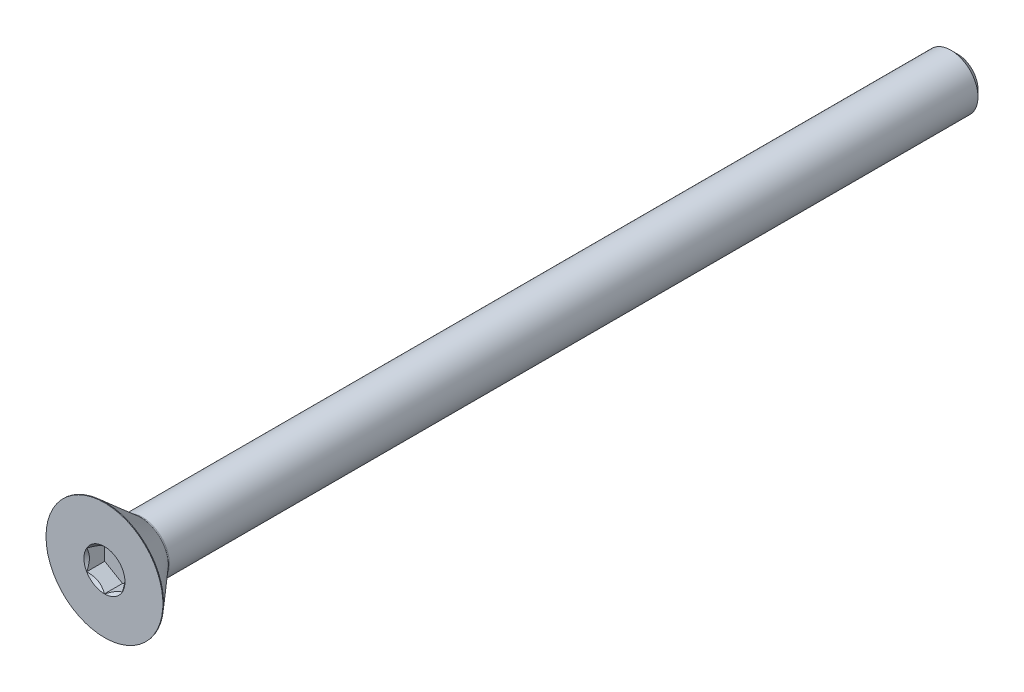
ISO-10303-21;
HEADER;
FILE_DESCRIPTION(('STEP AP214'),'2;1');
FILE_NAME('part.step','',(''),(''),'','','');
FILE_SCHEMA(('AUTOMOTIVE_DESIGN { 1 0 10303 214 1 1 1 1 }'));
ENDSEC;
DATA;
#1=APPLICATION_CONTEXT('core data for automotive mechanical design processes');
#2=APPLICATION_PROTOCOL_DEFINITION('international standard','automotive_design',2000,#1);
#3=PRODUCT_CONTEXT('',#1,'mechanical');
#4=PRODUCT('Part','Part','',(#3));
#5=PRODUCT_RELATED_PRODUCT_CATEGORY('part','',(#4));
#6=PRODUCT_DEFINITION_FORMATION('','',#4);
#7=PRODUCT_DEFINITION_CONTEXT('part definition',#1,'design');
#8=PRODUCT_DEFINITION('design','',#6,#7);
#9=PRODUCT_DEFINITION_SHAPE('','',#8);
#10=(LENGTH_UNIT() NAMED_UNIT(*) SI_UNIT(.MILLI.,.METRE.));
#11=(NAMED_UNIT(*) PLANE_ANGLE_UNIT() SI_UNIT($,.RADIAN.));
#12=(NAMED_UNIT(*) SI_UNIT($,.STERADIAN.) SOLID_ANGLE_UNIT());
#13=UNCERTAINTY_MEASURE_WITH_UNIT(LENGTH_MEASURE(1.E-05),#10,'distance_accuracy_value','');
#14=(GEOMETRIC_REPRESENTATION_CONTEXT(3) GLOBAL_UNCERTAINTY_ASSIGNED_CONTEXT((#13)) GLOBAL_UNIT_ASSIGNED_CONTEXT((#10,
#11,#12)) REPRESENTATION_CONTEXT('',''));
#15=CARTESIAN_POINT('',(0.,0.,0.));
#16=DIRECTION('',(0.,0.,1.));
#17=DIRECTION('',(1.,0.,0.));
#18=AXIS2_PLACEMENT_3D('',#15,#16,#17);
#19=CARTESIAN_POINT('',(0.,0.,38.1));
#20=DIRECTION('',(0.,0.,1.));
#21=DIRECTION('',(1.,0.,0.));
#22=AXIS2_PLACEMENT_3D('',#19,#20,#21);
#23=CONICAL_SURFACE('',#22,1.83308710467706,0.78539816339745);
#24=CARTESIAN_POINT('',(0.,0.,38.1));
#25=DIRECTION('',(0.,0.,1.));
#26=DIRECTION('',(1.,0.,0.));
#27=AXIS2_PLACEMENT_3D('',#24,#25,#26);
#28=CIRCLE('',#27,1.83308710467706);
#29=CARTESIAN_POINT('',(0.,-1.83308710467706,38.1));
#30=VERTEX_POINT('',#29);
#31=CARTESIAN_POINT('',(1.5875,-0.916543552338532,38.1));
#32=VERTEX_POINT('',#31);
#33=EDGE_CURVE('E233',#30,#32,#28,.T.);
#34=ORIENTED_EDGE('',*,*,#33,.T.);
#35=CARTESIAN_POINT('',(1.5877,-0.916428082284693,38.1001154809637));
#36=CARTESIAN_POINT('',(1.53312479190086,-0.947937093371809,38.0686308083706));
#37=CARTESIAN_POINT('',(1.47763696320971,-0.979973006203394,38.0389950460135));
#38=CARTESIAN_POINT('',(1.36449087915364,-1.04529792829092,37.9847322600208));
#39=CARTESIAN_POINT('',(1.30682185887062,-1.07859315267522,37.9601354351332));
#40=CARTESIAN_POINT('',(1.1905349781269,-1.14573141457583,37.9180003642726));
#41=CARTESIAN_POINT('',(1.13194674474407,-1.17955734689075,37.9003561927298));
#42=CARTESIAN_POINT('',(1.01348022674557,-1.24795402294714,37.873171470085));
#43=CARTESIAN_POINT('',(0.953605562983895,-1.28252267618759,37.8636106206951));
#44=CARTESIAN_POINT('',(0.850418771876558,-1.34209759781022,37.854984413104));
#45=CARTESIAN_POINT('',(0.807240015952288,-1.36702686416637,37.8537071928096));
#46=CARTESIAN_POINT('',(0.720953038535399,-1.41684467380557,37.8558570558147));
#47=CARTESIAN_POINT('',(0.677844847078612,-1.44173319974742,37.8592857885493));
#48=CARTESIAN_POINT('',(0.592046335002031,-1.49126899379091,37.8706509944333));
#49=CARTESIAN_POINT('',(0.549356408925406,-1.51591603410293,37.8785913718016));
#50=CARTESIAN_POINT('',(0.464693063478358,-1.56479643938728,37.8985484144511));
#51=CARTESIAN_POINT('',(0.422719959755075,-1.58902962212064,37.9105668292087));
#52=CARTESIAN_POINT('',(0.315211458113566,-1.65109968448354,37.9462468972472));
#53=CARTESIAN_POINT('',(0.250342771708898,-1.68855163804125,37.9725985723031));
#54=CARTESIAN_POINT('',(0.154961599380922,-1.74361998356043,38.0170835368517));
#55=CARTESIAN_POINT('',(0.123530699536156,-1.76176662204668,38.0327128578011));
#56=CARTESIAN_POINT('',(0.061246985569636,-1.79772614107138,38.0653984878611));
#57=CARTESIAN_POINT('',(0.0303939039605752,-1.8155391760437,38.082454115657));
#58=CARTESIAN_POINT('',(-0.000200000000001831,-1.8332025747309,38.1001154809637));
#59=B_SPLINE_CURVE_WITH_KNOTS('',3,(#35,#36,#37,#38,#39,#40,#41,#42,#43,#44,#45,#46,#47,#48,#49,
#50,#51,#52,#53,#54,#55,#56,#57,#58),.UNSPECIFIED.,.F.,.F.,(4,2,2,2,2,2,2,2,2,2,2,4),(0.,
0.211482650810816,0.424197870807277,0.633533884524818,0.842342653263349,0.991755553727142,
1.14122083674205,1.29081565918877,1.44047473906438,1.6781878086972,1.79671410024894,
1.91518409436631),.UNSPECIFIED.);
#60=EDGE_CURVE('E11',#32,#30,#59,.T.);
#61=ORIENTED_EDGE('',*,*,#60,.T.);
#62=EDGE_LOOP('',(#34,#61));
#63=FACE_BOUND('',#62,.T.);
#64=ADVANCED_FACE('F35',(#63),#23,.F.);
#65=CARTESIAN_POINT('',(-1.5875,-0.91654355233853,38.1));
#66=VERTEX_POINT('',#65);
#67=EDGE_CURVE('E238',#66,#30,#28,.T.);
#68=ORIENTED_EDGE('',*,*,#67,.T.);
#69=CARTESIAN_POINT('',(0.000200000000000431,-1.8332025747309,38.1001154809637));
#70=CARTESIAN_POINT('',(-0.0543752080991352,-1.80169356364378,38.0686308083706));
#71=CARTESIAN_POINT('',(-0.109863036790289,-1.7696576508122,38.0389950460135));
#72=CARTESIAN_POINT('',(-0.223009120846358,-1.70433272872468,37.9847322600208));
#73=CARTESIAN_POINT('',(-0.280678141129381,-1.67103750434037,37.9601354351332));
#74=CARTESIAN_POINT('',(-0.396965021873103,-1.60389924243976,37.9180003642726));
#75=CARTESIAN_POINT('',(-0.455553255255931,-1.57007331012484,37.9003561927298));
#76=CARTESIAN_POINT('',(-0.574019773254431,-1.50167663406845,37.873171470085));
#77=CARTESIAN_POINT('',(-0.633894437016105,-1.46710798082801,37.8636106206951));
#78=CARTESIAN_POINT('',(-0.737081228123442,-1.40753305920537,37.854984413104));
#79=CARTESIAN_POINT('',(-0.780259984047712,-1.38260379284922,37.8537071928096));
#80=CARTESIAN_POINT('',(-0.866546961464601,-1.33278598321002,37.8558570558147));
#81=CARTESIAN_POINT('',(-0.909655152921388,-1.30789745726817,37.8592857885493));
#82=CARTESIAN_POINT('',(-0.995453664997969,-1.25836166322468,37.8706509944333));
#83=CARTESIAN_POINT('',(-1.03814359107459,-1.23371462291266,37.8785913718016));
#84=CARTESIAN_POINT('',(-1.12280693652164,-1.18483421762831,37.8985484144511));
#85=CARTESIAN_POINT('',(-1.16478004024493,-1.16060103489495,37.9105668292087));
#86=CARTESIAN_POINT('',(-1.27228854188643,-1.09853097253205,37.9462468972472));
#87=CARTESIAN_POINT('',(-1.3371572282911,-1.06107901897434,37.9725985723031));
#88=CARTESIAN_POINT('',(-1.43253840061908,-1.00601067345516,38.0170835368517));
#89=CARTESIAN_POINT('',(-1.46396930046384,-0.987864034968913,38.0327128578011));
#90=CARTESIAN_POINT('',(-1.52625301443036,-0.951904515944213,38.0653984878611));
#91=CARTESIAN_POINT('',(-1.55710609603942,-0.934091480971892,38.082454115657));
#92=CARTESIAN_POINT('',(-1.5877,-0.916428082284692,38.1001154809637));
#93=B_SPLINE_CURVE_WITH_KNOTS('',3,(#69,#70,#71,#72,#73,#74,#75,#76,#77,#78,#79,#80,#81,#82,#83,
#84,#85,#86,#87,#88,#89,#90,#91,#92),.UNSPECIFIED.,.F.,.F.,(4,2,2,2,2,2,2,2,2,2,2,4),(0.,
0.211482650810816,0.424197870807277,0.633533884524818,0.842342653263349,0.991755553727142,
1.14122083674205,1.29081565918877,1.44047473906438,1.6781878086972,1.79671410024894,
1.91518409436631),.UNSPECIFIED.);
#94=EDGE_CURVE('E49',#30,#66,#93,.T.);
#95=ORIENTED_EDGE('',*,*,#94,.T.);
#96=EDGE_LOOP('',(#68,#95));
#97=FACE_BOUND('',#96,.T.);
#98=ADVANCED_FACE('F224',(#97),#23,.F.);
#99=CARTESIAN_POINT('',(-1.5875,0.916543552338532,38.1));
#100=VERTEX_POINT('',#99);
#101=EDGE_CURVE('E239',#100,#66,#28,.T.);
#102=ORIENTED_EDGE('',*,*,#101,.T.);
#103=CARTESIAN_POINT('',(-1.5875,-1.84970477544497,38.7044452553756));
#104=CARTESIAN_POINT('',(-1.5875,-1.80476240151239,38.6703462071708));
#105=CARTESIAN_POINT('',(-1.5875,-1.75957199117801,38.6365750198928));
#106=CARTESIAN_POINT('',(-1.5875,-1.66859358881314,38.5698243913548));
#107=CARTESIAN_POINT('',(-1.5875,-1.62280545181692,38.5368451478851));
#108=CARTESIAN_POINT('',(-1.5875,-1.48372199901346,38.4388287251651));
#109=CARTESIAN_POINT('',(-1.5875,-1.38939051274161,38.3752376365291));
#110=CARTESIAN_POINT('',(-1.5875,-1.1914395580246,38.2501998751445));
#111=CARTESIAN_POINT('',(-1.5875,-1.08759987522282,38.1890979424035));
#112=CARTESIAN_POINT('',(-1.5875,-0.874706489386582,38.0771896537273));
#113=CARTESIAN_POINT('',(-1.5875,-0.76567197590225,38.0263485632185));
#114=CARTESIAN_POINT('',(-1.5875,-0.602217292000081,37.9641427739001));
#115=CARTESIAN_POINT('',(-1.5875,-0.550263299202898,37.9463261951995));
#116=CARTESIAN_POINT('',(-1.5875,-0.445082037721642,37.9148615140692));
#117=CARTESIAN_POINT('',(-1.5875,-0.391854683409841,37.9012136928237));
#118=CARTESIAN_POINT('',(-1.5875,-0.285344657080772,37.8790290273729));
#119=CARTESIAN_POINT('',(-1.5875,-0.23208080021017,37.8704032745585));
#120=CARTESIAN_POINT('',(-1.5875,-0.124959456415258,37.8584346825164));
#121=CARTESIAN_POINT('',(-1.5875,-0.0711020784671781,37.8550908892227));
#122=CARTESIAN_POINT('',(-1.5875,0.0346213127870723,37.8539438271109));
#123=CARTESIAN_POINT('',(-1.5875,0.0864851538798602,37.8559346608082));
#124=CARTESIAN_POINT('',(-1.5875,0.189778917943214,37.8648876527514));
#125=CARTESIAN_POINT('',(-1.5875,0.241208798942214,37.8718502864056));
#126=CARTESIAN_POINT('',(-1.5875,0.344133383886249,37.8904812853777));
#127=CARTESIAN_POINT('',(-1.5875,0.395613227208262,37.9022304949867));
#128=CARTESIAN_POINT('',(-1.5875,0.49744523880822,37.9298036611326));
#129=CARTESIAN_POINT('',(-1.5875,0.547797493505242,37.9456273042326));
#130=CARTESIAN_POINT('',(-1.5875,0.705347074888852,38.0011176410875));
#131=CARTESIAN_POINT('',(-1.5875,0.810327219424591,38.0470631846965));
#132=CARTESIAN_POINT('',(-1.5875,1.01536433721947,38.1492446076069));
#133=CARTESIAN_POINT('',(-1.5875,1.1154020418522,38.2055172602773));
#134=CARTESIAN_POINT('',(-1.5875,1.30660224236785,38.3216420088267));
#135=CARTESIAN_POINT('',(-1.5875,1.39795887507227,38.3811784333227));
#136=CARTESIAN_POINT('',(-1.5875,1.53255412415746,38.4732282143955));
#137=CARTESIAN_POINT('',(-1.5875,1.57683885315435,38.5042385020961));
#138=CARTESIAN_POINT('',(-1.5875,1.66480239811795,38.5670825224737));
#139=CARTESIAN_POINT('',(-1.5875,1.70848137749646,38.5989160261633));
#140=CARTESIAN_POINT('',(-1.5875,1.75190803967257,38.6310909828344));
#141=B_SPLINE_CURVE_WITH_KNOTS('',3,(#103,#104,#105,#106,#107,#108,#109,#110,#111,#112,#113,
#114,#115,#116,#117,#118,#119,#120,#121,#122,#123,#124,#125,#126,#127,#128,#129,#130,#131,#132,
#133,#134,#135,#136,#137,#138,#139,#140),.UNSPECIFIED.,.F.,.F.,(4,2,2,2,2,2,2,2,2,2,2,2,2,2,2,2,
2,2,4),(0.,0.16923836493243,0.338518567064951,0.679661123808213,1.04081978780736,
1.40073457216113,1.56536778601317,1.73001210198752,1.89164527462954,2.05324924857509,
2.20870658565539,2.36417878970806,2.52239358424591,2.68059621131738,3.0233722729095,
3.36739346781147,3.69436280662922,3.85654464660761,4.0186818490024),.UNSPECIFIED.);
#142=EDGE_CURVE('E198',#66,#100,#141,.T.);
#143=ORIENTED_EDGE('',*,*,#142,.T.);
#144=EDGE_LOOP('',(#102,#143));
#145=FACE_BOUND('',#144,.T.);
#146=ADVANCED_FACE('F229',(#145),#23,.F.);
#147=CARTESIAN_POINT('',(0.,1.83308710467706,38.1));
#148=VERTEX_POINT('',#147);
#149=EDGE_CURVE('E142',#148,#100,#28,.T.);
#150=ORIENTED_EDGE('',*,*,#149,.T.);
#151=CARTESIAN_POINT('',(-1.5877,0.916428082284694,38.1001154809637));
#152=CARTESIAN_POINT('',(-1.53312479190087,0.947937093371809,38.0686308083706));
#153=CARTESIAN_POINT('',(-1.47763696320971,0.979973006203395,38.0389950460135));
#154=CARTESIAN_POINT('',(-1.36449087915364,1.04529792829092,37.9847322600208));
#155=CARTESIAN_POINT('',(-1.30682185887062,1.07859315267522,37.9601354351332));
#156=CARTESIAN_POINT('',(-1.1905349781269,1.14573141457583,37.9180003642726));
#157=CARTESIAN_POINT('',(-1.13194674474407,1.17955734689075,37.9003561927298));
#158=CARTESIAN_POINT('',(-1.01348022674557,1.24795402294714,37.873171470085));
#159=CARTESIAN_POINT('',(-0.953605562983896,1.28252267618759,37.8636106206951));
#160=CARTESIAN_POINT('',(-0.850418771876559,1.34209759781022,37.854984413104));
#161=CARTESIAN_POINT('',(-0.807240015952289,1.36702686416637,37.8537071928096));
#162=CARTESIAN_POINT('',(-0.7209530385354,1.41684467380557,37.8558570558147));
#163=CARTESIAN_POINT('',(-0.677844847078613,1.44173319974742,37.8592857885493));
#164=CARTESIAN_POINT('',(-0.592046335002032,1.49126899379091,37.8706509944333));
#165=CARTESIAN_POINT('',(-0.549356408925407,1.51591603410293,37.8785913718016));
#166=CARTESIAN_POINT('',(-0.46469306347836,1.56479643938728,37.8985484144511));
#167=CARTESIAN_POINT('',(-0.422719959755076,1.58902962212064,37.9105668292087));
#168=CARTESIAN_POINT('',(-0.315211458113567,1.65109968448354,37.9462468972472));
#169=CARTESIAN_POINT('',(-0.2503427717089,1.68855163804125,37.9725985723031));
#170=CARTESIAN_POINT('',(-0.154961599380924,1.74361998356043,38.0170835368517));
#171=CARTESIAN_POINT('',(-0.123530699536157,1.76176662204668,38.0327128578011));
#172=CARTESIAN_POINT('',(-0.061246985569637,1.79772614107138,38.0653984878611));
#173=CARTESIAN_POINT('',(-0.0303939039605758,1.8155391760437,38.082454115657));
#174=CARTESIAN_POINT('',(0.000200000000001483,1.8332025747309,38.1001154809637));
#175=B_SPLINE_CURVE_WITH_KNOTS('',3,(#151,#152,#153,#154,#155,#156,#157,#158,#159,#160,#161,
#162,#163,#164,#165,#166,#167,#168,#169,#170,#171,#172,#173,#174),.UNSPECIFIED.,.F.,.F.,(4,2,2,
2,2,2,2,2,2,2,2,4),(0.,0.211482650810816,0.424197870807276,0.633533884524818,0.842342653263348,
0.991755553727141,1.14122083674205,1.29081565918877,1.44047473906438,1.6781878086972,
1.79671410024894,1.91518409436631),.UNSPECIFIED.);
#176=EDGE_CURVE('E106',#100,#148,#175,.T.);
#177=ORIENTED_EDGE('',*,*,#176,.T.);
#178=EDGE_LOOP('',(#150,#177));
#179=FACE_BOUND('',#178,.T.);
#180=ADVANCED_FACE('F252',(#179),#23,.F.);
#181=CARTESIAN_POINT('',(1.5875,0.916543552338531,38.1));
#182=VERTEX_POINT('',#181);
#183=EDGE_CURVE('E138',#182,#148,#28,.T.);
#184=ORIENTED_EDGE('',*,*,#183,.T.);
#185=CARTESIAN_POINT('',(-0.000200000000000509,1.8332025747309,38.1001154809637));
#186=CARTESIAN_POINT('',(0.054375208099135,1.80169356364378,38.0686308083706));
#187=CARTESIAN_POINT('',(0.109863036790288,1.7696576508122,38.0389950460135));
#188=CARTESIAN_POINT('',(0.223009120846358,1.70433272872468,37.9847322600208));
#189=CARTESIAN_POINT('',(0.280678141129381,1.67103750434037,37.9601354351332));
#190=CARTESIAN_POINT('',(0.396965021873103,1.60389924243976,37.9180003642726));
#191=CARTESIAN_POINT('',(0.455553255255931,1.57007331012484,37.9003561927298));
#192=CARTESIAN_POINT('',(0.574019773254431,1.50167663406845,37.873171470085));
#193=CARTESIAN_POINT('',(0.633894437016105,1.46710798082801,37.8636106206951));
#194=CARTESIAN_POINT('',(0.737081228123442,1.40753305920537,37.854984413104));
#195=CARTESIAN_POINT('',(0.780259984047712,1.38260379284922,37.8537071928096));
#196=CARTESIAN_POINT('',(0.866546961464601,1.33278598321002,37.8558570558147));
#197=CARTESIAN_POINT('',(0.909655152921388,1.30789745726817,37.8592857885493));
#198=CARTESIAN_POINT('',(0.99545366499797,1.25836166322468,37.8706509944333));
#199=CARTESIAN_POINT('',(1.03814359107459,1.23371462291266,37.8785913718016));
#200=CARTESIAN_POINT('',(1.12280693652164,1.18483421762831,37.8985484144511));
#201=CARTESIAN_POINT('',(1.16478004024493,1.16060103489495,37.9105668292087));
#202=CARTESIAN_POINT('',(1.27228854188643,1.09853097253205,37.9462468972472));
#203=CARTESIAN_POINT('',(1.3371572282911,1.06107901897434,37.9725985723031));
#204=CARTESIAN_POINT('',(1.43253840061908,1.00601067345516,38.0170835368517));
#205=CARTESIAN_POINT('',(1.46396930046385,0.987864034968913,38.0327128578011));
#206=CARTESIAN_POINT('',(1.52625301443037,0.951904515944213,38.0653984878611));
#207=CARTESIAN_POINT('',(1.55710609603943,0.934091480971892,38.082454115657));
#208=CARTESIAN_POINT('',(1.5877,0.916428082284692,38.1001154809637));
#209=B_SPLINE_CURVE_WITH_KNOTS('',3,(#185,#186,#187,#188,#189,#190,#191,#192,#193,#194,#195,
#196,#197,#198,#199,#200,#201,#202,#203,#204,#205,#206,#207,#208),.UNSPECIFIED.,.F.,.F.,(4,2,2,
2,2,2,2,2,2,2,2,4),(0.,0.211482650810816,0.424197870807277,0.633533884524818,0.842342653263349,
0.991755553727143,1.14122083674205,1.29081565918878,1.44047473906438,1.6781878086972,
1.79671410024894,1.91518409436631),.UNSPECIFIED.);
#210=EDGE_CURVE('E168',#148,#182,#209,.T.);
#211=ORIENTED_EDGE('',*,*,#210,.T.);
#212=EDGE_LOOP('',(#184,#211));
#213=FACE_BOUND('',#212,.T.);
#214=ADVANCED_FACE('F185',(#213),#23,.F.);
#215=CARTESIAN_POINT('',(0.,0.,-38.1));
#216=DIRECTION('',(0.,0.,-1.));
#217=DIRECTION('',(-1.,0.,0.));
#218=AXIS2_PLACEMENT_3D('',#215,#216,#217);
#219=CYLINDRICAL_SURFACE('',#218,5.21970000000001);
#220=CARTESIAN_POINT('',(0.,0.,38.1));
#221=DIRECTION('',(0.,0.,-1.));
#222=DIRECTION('',(-1.,0.,0.));
#223=AXIS2_PLACEMENT_3D('',#220,#221,#222);
#224=CIRCLE('',#223,5.21970000000001);
#225=CARTESIAN_POINT('',(-5.21970000000001,0.,38.1));
#226=VERTEX_POINT('',#225);
#227=EDGE_CURVE('E157',#226,#226,#224,.T.);
#228=ORIENTED_EDGE('',*,*,#227,.T.);
#229=EDGE_LOOP('',(#228));
#230=FACE_BOUND('',#229,.T.);
#231=CARTESIAN_POINT('',(0.,0.,38.035484));
#232=DIRECTION('',(0.,0.,-1.));
#233=DIRECTION('',(-1.,0.,0.));
#234=AXIS2_PLACEMENT_3D('',#231,#232,#233);
#235=CIRCLE('',#234,5.21970000000001);
#236=CARTESIAN_POINT('',(-5.21970000000001,0.,38.035484));
#237=VERTEX_POINT('',#236);
#238=EDGE_CURVE('E141',#237,#237,#235,.T.);
#239=ORIENTED_EDGE('',*,*,#238,.F.);
#240=EDGE_LOOP('',(#239));
#241=FACE_BOUND('',#240,.T.);
#242=ADVANCED_FACE('F37',(#230,#241),#219,.T.);
#243=CARTESIAN_POINT('',(0.,0.,38.1));
#244=DIRECTION('',(0.,0.,1.));
#245=DIRECTION('',(1.,0.,0.));
#246=AXIS2_PLACEMENT_3D('',#243,#244,#245);
#247=PLANE('',#246);
#248=ORIENTED_EDGE('',*,*,#183,.F.);
#249=EDGE_CURVE('E131',#32,#182,#28,.T.);
#250=ORIENTED_EDGE('',*,*,#249,.F.);
#251=ORIENTED_EDGE('',*,*,#33,.F.);
#252=ORIENTED_EDGE('',*,*,#67,.F.);
#253=ORIENTED_EDGE('',*,*,#101,.F.);
#254=ORIENTED_EDGE('',*,*,#149,.F.);
#255=EDGE_LOOP('',(#248,#250,#251,#252,#253,#254));
#256=FACE_BOUND('',#255,.T.);
#257=ORIENTED_EDGE('',*,*,#227,.F.);
#258=EDGE_LOOP('',(#257));
#259=FACE_BOUND('',#258,.T.);
#260=ADVANCED_FACE('F243',(#256,#259),#247,.T.);
#261=CARTESIAN_POINT('',(0.,1.81768750000001,-38.1));
#262=DIRECTION('',(0.,0.,-1.));
#263=DIRECTION('',(-1.,0.,0.));
#264=AXIS2_PLACEMENT_3D('',#261,#262,#263);
#265=PLANE('',#264);
#266=CARTESIAN_POINT('',(0.,0.,-38.1));
#267=DIRECTION('',(0.,0.,-1.));
#268=DIRECTION('',(-1.,0.,0.));
#269=AXIS2_PLACEMENT_3D('',#266,#267,#268);
#270=CIRCLE('',#269,1.81768750000001);
#271=CARTESIAN_POINT('',(-1.81768750000001,0.,-38.1));
#272=VERTEX_POINT('',#271);
#273=EDGE_CURVE('E154',#272,#272,#270,.T.);
#274=ORIENTED_EDGE('',*,*,#273,.T.);
#275=EDGE_LOOP('',(#274));
#276=FACE_BOUND('',#275,.T.);
#277=ADVANCED_FACE('F307',(#276),#265,.T.);
#278=CARTESIAN_POINT('',(0.,0.,-38.1));
#279=DIRECTION('',(0.,0.,1.));
#280=DIRECTION('',(1.,0.,0.));
#281=AXIS2_PLACEMENT_3D('',#278,#279,#280);
#282=CONICAL_SURFACE('',#281,1.81768750000001,0.785398163397454);
#283=CARTESIAN_POINT('',(0.,0.,-37.5046875));
#284=DIRECTION('',(0.,0.,-1.));
#285=DIRECTION('',(-1.,0.,0.));
#286=AXIS2_PLACEMENT_3D('',#283,#284,#285);
#287=CIRCLE('',#286,2.41300000000002);
#288=CARTESIAN_POINT('',(-2.41300000000002,0.,-37.5046875));
#289=VERTEX_POINT('',#288);
#290=EDGE_CURVE('E151',#289,#289,#287,.T.);
#291=ORIENTED_EDGE('',*,*,#290,.T.);
#292=EDGE_LOOP('',(#291));
#293=FACE_BOUND('',#292,.T.);
#294=ORIENTED_EDGE('',*,*,#273,.F.);
#295=EDGE_LOOP('',(#294));
#296=FACE_BOUND('',#295,.T.);
#297=ADVANCED_FACE('F297',(#293,#296),#282,.T.);
#298=CARTESIAN_POINT('',(0.,0.,-38.1));
#299=DIRECTION('',(0.,0.,-1.));
#300=DIRECTION('',(-1.,0.,0.));
#301=AXIS2_PLACEMENT_3D('',#298,#299,#300);
#302=CYLINDRICAL_SURFACE('',#301,2.41300000000001);
#303=CARTESIAN_POINT('',(0.,0.,34.7173662286613));
#304=DIRECTION('',(0.,0.,-1.));
#305=DIRECTION('',(-1.,0.,0.));
#306=AXIS2_PLACEMENT_3D('',#303,#304,#305);
#307=CIRCLE('',#306,2.413);
#308=CARTESIAN_POINT('',(-2.413,0.,34.7173662286613));
#309=VERTEX_POINT('',#308);
#310=EDGE_CURVE('E148',#309,#309,#307,.T.);
#311=ORIENTED_EDGE('',*,*,#310,.T.);
#312=EDGE_LOOP('',(#311));
#313=FACE_BOUND('',#312,.T.);
#314=ORIENTED_EDGE('',*,*,#290,.F.);
#315=EDGE_LOOP('',(#314));
#316=FACE_BOUND('',#315,.T.);
#317=ADVANCED_FACE('F288',(#313,#316),#302,.T.);
#318=CARTESIAN_POINT('',(0.,0.,34.7173662286613));
#319=DIRECTION('',(0.,0.,-1.));
#320=DIRECTION('',(-1.,0.,0.));
#321=AXIS2_PLACEMENT_3D('',#318,#319,#320);
#322=TOROIDAL_SURFACE('',#321,2.65205436006272,0.239054360062718);
#323=CARTESIAN_POINT('',(0.,0.,34.8742));
#324=DIRECTION('',(0.,0.,-1.));
#325=DIRECTION('',(-1.,0.,0.));
#326=AXIS2_PLACEMENT_3D('',#323,#324,#325);
#327=CIRCLE('',#326,2.47163774432936);
#328=CARTESIAN_POINT('',(-2.47163774432936,0.,34.8742));
#329=VERTEX_POINT('',#328);
#330=EDGE_CURVE('E145',#329,#329,#327,.T.);
#331=ORIENTED_EDGE('',*,*,#330,.T.);
#332=EDGE_LOOP('',(#331));
#333=FACE_BOUND('',#332,.T.);
#334=ORIENTED_EDGE('',*,*,#310,.F.);
#335=EDGE_LOOP('',(#334));
#336=FACE_BOUND('',#335,.T.);
#337=ADVANCED_FACE('F278',(#333,#336),#322,.F.);
#338=CARTESIAN_POINT('',(0.,0.,34.8742));
#339=DIRECTION('',(0.,0.,1.));
#340=DIRECTION('',(1.,0.,0.));
#341=AXIS2_PLACEMENT_3D('',#338,#339,#340);
#342=CONICAL_SURFACE('',#341,2.47163774432936,0.715584993317677);
#343=ORIENTED_EDGE('',*,*,#238,.T.);
#344=EDGE_LOOP('',(#343));
#345=FACE_BOUND('',#344,.T.);
#346=ORIENTED_EDGE('',*,*,#330,.F.);
#347=EDGE_LOOP('',(#346));
#348=FACE_BOUND('',#347,.T.);
#349=ADVANCED_FACE('F183',(#345,#348),#342,.T.);
#350=ORIENTED_EDGE('',*,*,#249,.T.);
#351=CARTESIAN_POINT('',(1.5875,-1.84970477544497,38.7044452553756));
#352=CARTESIAN_POINT('',(1.5875,-1.8047624015124,38.6703462071708));
#353=CARTESIAN_POINT('',(1.5875,-1.75957199117802,38.6365750198928));
#354=CARTESIAN_POINT('',(1.5875,-1.66859358881315,38.5698243913548));
#355=CARTESIAN_POINT('',(1.5875,-1.62280545181693,38.5368451478852));
#356=CARTESIAN_POINT('',(1.5875,-1.48372199901346,38.4388287251651));
#357=CARTESIAN_POINT('',(1.5875,-1.38939051274161,38.3752376365292));
#358=CARTESIAN_POINT('',(1.5875,-1.1914395580246,38.2501998751445));
#359=CARTESIAN_POINT('',(1.5875,-1.08759987522282,38.1890979424035));
#360=CARTESIAN_POINT('',(1.5875,-0.874706489386582,38.0771896537273));
#361=CARTESIAN_POINT('',(1.5875,-0.765671975902249,38.0263485632185));
#362=CARTESIAN_POINT('',(1.5875,-0.60221729200008,37.9641427739001));
#363=CARTESIAN_POINT('',(1.5875,-0.550263299202897,37.9463261951995));
#364=CARTESIAN_POINT('',(1.5875,-0.445082037721641,37.9148615140692));
#365=CARTESIAN_POINT('',(1.5875,-0.391854683409841,37.9012136928237));
#366=CARTESIAN_POINT('',(1.5875,-0.285344657080771,37.8790290273729));
#367=CARTESIAN_POINT('',(1.5875,-0.232080800210169,37.8704032745585));
#368=CARTESIAN_POINT('',(1.5875,-0.124959456415258,37.8584346825164));
#369=CARTESIAN_POINT('',(1.5875,-0.0711020784671782,37.8550908892227));
#370=CARTESIAN_POINT('',(1.5875,0.0346213127870719,37.8539438271109));
#371=CARTESIAN_POINT('',(1.5875,0.0864851538798597,37.8559346608082));
#372=CARTESIAN_POINT('',(1.5875,0.189778917943213,37.8648876527514));
#373=CARTESIAN_POINT('',(1.5875,0.241208798942213,37.8718502864056));
#374=CARTESIAN_POINT('',(1.5875,0.344133383886248,37.8904812853777));
#375=CARTESIAN_POINT('',(1.5875,0.395613227208262,37.9022304949867));
#376=CARTESIAN_POINT('',(1.5875,0.49744523880822,37.9298036611326));
#377=CARTESIAN_POINT('',(1.5875,0.547797493505242,37.9456273042326));
#378=CARTESIAN_POINT('',(1.5875,0.70534707488885,38.0011176410875));
#379=CARTESIAN_POINT('',(1.5875,0.810327219424589,38.0470631846965));
#380=CARTESIAN_POINT('',(1.5875,1.01536433721947,38.1492446076069));
#381=CARTESIAN_POINT('',(1.5875,1.1154020418522,38.2055172602773));
#382=CARTESIAN_POINT('',(1.5875,1.30660224236784,38.3216420088267));
#383=CARTESIAN_POINT('',(1.5875,1.39795887507227,38.3811784333227));
#384=CARTESIAN_POINT('',(1.5875,1.53255412415746,38.4732282143955));
#385=CARTESIAN_POINT('',(1.5875,1.57683885315434,38.5042385020961));
#386=CARTESIAN_POINT('',(1.5875,1.66480239811794,38.5670825224737));
#387=CARTESIAN_POINT('',(1.5875,1.70848137749645,38.5989160261633));
#388=CARTESIAN_POINT('',(1.5875,1.75190803967257,38.6310909828344));
#389=B_SPLINE_CURVE_WITH_KNOTS('',3,(#351,#352,#353,#354,#355,#356,#357,#358,#359,#360,#361,
#362,#363,#364,#365,#366,#367,#368,#369,#370,#371,#372,#373,#374,#375,#376,#377,#378,#379,#380,
#381,#382,#383,#384,#385,#386,#387,#388),.UNSPECIFIED.,.F.,.F.,(4,2,2,2,2,2,2,2,2,2,2,2,2,2,2,2,
2,2,4),(0.,0.169238364932428,0.338518567064949,0.679661123808217,1.04081978780736,
1.40073457216113,1.56536778601318,1.73001210198753,1.89164527462955,2.0532492485751,
2.2087065856554,2.36417878970806,2.52239358424591,2.68059621131738,3.02337227290949,
3.36739346781147,3.69436280662922,3.85654464660761,4.01868184900241),.UNSPECIFIED.);
#390=EDGE_CURVE('E160',#182,#32,#389,.F.);
#391=ORIENTED_EDGE('',*,*,#390,.T.);
#392=EDGE_LOOP('',(#350,#391));
#393=FACE_BOUND('',#392,.T.);
#394=ADVANCED_FACE('F177',(#393),#23,.F.);
#395=CARTESIAN_POINT('',(0.,-1.83308710467706,36.4871));
#396=DIRECTION('',(0.5,-0.866025403784439,0.));
#397=DIRECTION('',(0.866025403784439,0.5,0.));
#398=AXIS2_PLACEMENT_3D('',#395,#396,#397);
#399=PLANE('',#398);
#400=DIRECTION('',(0.,0.,1.));
#401=VECTOR('',#400,1.);
#402=CARTESIAN_POINT('',(1.5875,-0.916543552338531,36.4871));
#403=LINE('',#402,#401);
#404=CARTESIAN_POINT('',(1.5875,-0.916543552338531,36.4871));
#405=VERTEX_POINT('',#404);
#406=EDGE_CURVE('E56',#405,#32,#403,.T.);
#407=ORIENTED_EDGE('',*,*,#406,.F.);
#408=DIRECTION('',(0.866025403784439,0.5,0.));
#409=VECTOR('',#408,1.);
#410=CARTESIAN_POINT('',(0.,-1.83308710467706,36.4871));
#411=LINE('',#410,#409);
#412=CARTESIAN_POINT('',(0.,-1.83308710467706,36.4871));
#413=VERTEX_POINT('',#412);
#414=EDGE_CURVE('E409',#413,#405,#411,.T.);
#415=ORIENTED_EDGE('',*,*,#414,.F.);
#416=DIRECTION('',(0.,0.,1.));
#417=VECTOR('',#416,1.);
#418=CARTESIAN_POINT('',(0.,-1.83308710467706,36.4871));
#419=LINE('',#418,#417);
#420=EDGE_CURVE('E65',#413,#30,#419,.T.);
#421=ORIENTED_EDGE('',*,*,#420,.T.);
#422=ORIENTED_EDGE('',*,*,#60,.F.);
#423=EDGE_LOOP('',(#407,#415,#421,#422));
#424=FACE_BOUND('',#423,.T.);
#425=ADVANCED_FACE('F182',(#424),#399,.F.);
#426=CARTESIAN_POINT('',(-1.5875,-0.91654355233853,36.4871));
#427=DIRECTION('',(-0.5,-0.866025403784439,0.));
#428=DIRECTION('',(0.866025403784439,-0.5,0.));
#429=AXIS2_PLACEMENT_3D('',#426,#427,#428);
#430=PLANE('',#429);
#431=ORIENTED_EDGE('',*,*,#420,.F.);
#432=DIRECTION('',(0.866025403784438,-0.5,0.));
#433=VECTOR('',#432,1.);
#434=CARTESIAN_POINT('',(-1.5875,-0.91654355233853,36.4871));
#435=LINE('',#434,#433);
#436=CARTESIAN_POINT('',(-1.5875,-0.91654355233853,36.4871));
#437=VERTEX_POINT('',#436);
#438=EDGE_CURVE('E117',#437,#413,#435,.T.);
#439=ORIENTED_EDGE('',*,*,#438,.F.);
#440=DIRECTION('',(0.,0.,1.));
#441=VECTOR('',#440,1.);
#442=CARTESIAN_POINT('',(-1.5875,-0.91654355233853,36.4871));
#443=LINE('',#442,#441);
#444=EDGE_CURVE('E109',#437,#66,#443,.T.);
#445=ORIENTED_EDGE('',*,*,#444,.T.);
#446=ORIENTED_EDGE('',*,*,#94,.F.);
#447=EDGE_LOOP('',(#431,#439,#445,#446));
#448=FACE_BOUND('',#447,.T.);
#449=ADVANCED_FACE('F209',(#448),#430,.F.);
#450=CARTESIAN_POINT('',(-1.5875,0.916543552338532,36.4871));
#451=DIRECTION('',(-1.,0.,0.));
#452=DIRECTION('',(0.,0.,1.));
#453=AXIS2_PLACEMENT_3D('',#450,#451,#452);
#454=PLANE('',#453);
#455=ORIENTED_EDGE('',*,*,#444,.F.);
#456=DIRECTION('',(0.,-1.,0.));
#457=VECTOR('',#456,1.);
#458=CARTESIAN_POINT('',(-1.5875,0.916543552338532,36.4871));
#459=LINE('',#458,#457);
#460=CARTESIAN_POINT('',(-1.5875,0.916543552338532,36.4871));
#461=VERTEX_POINT('',#460);
#462=EDGE_CURVE('E113',#461,#437,#459,.T.);
#463=ORIENTED_EDGE('',*,*,#462,.F.);
#464=DIRECTION('',(0.,0.,1.));
#465=VECTOR('',#464,1.);
#466=CARTESIAN_POINT('',(-1.5875,0.916543552338532,36.4871));
#467=LINE('',#466,#465);
#468=EDGE_CURVE('E98',#461,#100,#467,.T.);
#469=ORIENTED_EDGE('',*,*,#468,.T.);
#470=ORIENTED_EDGE('',*,*,#142,.F.);
#471=EDGE_LOOP('',(#455,#463,#469,#470));
#472=FACE_BOUND('',#471,.T.);
#473=ADVANCED_FACE('F114',(#472),#454,.F.);
#474=CARTESIAN_POINT('',(0.,1.83308710467706,36.4871));
#475=DIRECTION('',(-0.5,0.866025403784439,0.));
#476=DIRECTION('',(-0.866025403784439,-0.5,0.));
#477=AXIS2_PLACEMENT_3D('',#474,#475,#476);
#478=PLANE('',#477);
#479=ORIENTED_EDGE('',*,*,#468,.F.);
#480=DIRECTION('',(-0.866025403784439,-0.5,0.));
#481=VECTOR('',#480,1.);
#482=CARTESIAN_POINT('',(0.,1.83308710467706,36.4871));
#483=LINE('',#482,#481);
#484=CARTESIAN_POINT('',(0.,1.83308710467706,36.4871));
#485=VERTEX_POINT('',#484);
#486=EDGE_CURVE('E103',#485,#461,#483,.T.);
#487=ORIENTED_EDGE('',*,*,#486,.F.);
#488=DIRECTION('',(0.,0.,1.));
#489=VECTOR('',#488,1.);
#490=CARTESIAN_POINT('',(0.,1.83308710467706,36.4871));
#491=LINE('',#490,#489);
#492=EDGE_CURVE('E110',#485,#148,#491,.T.);
#493=ORIENTED_EDGE('',*,*,#492,.T.);
#494=ORIENTED_EDGE('',*,*,#176,.F.);
#495=EDGE_LOOP('',(#479,#487,#493,#494));
#496=FACE_BOUND('',#495,.T.);
#497=ADVANCED_FACE('F100',(#496),#478,.F.);
#498=CARTESIAN_POINT('',(1.5875,0.916543552338531,36.4871));
#499=DIRECTION('',(0.5,0.866025403784439,0.));
#500=DIRECTION('',(-0.866025403784439,0.5,0.));
#501=AXIS2_PLACEMENT_3D('',#498,#499,#500);
#502=PLANE('',#501);
#503=ORIENTED_EDGE('',*,*,#492,.F.);
#504=DIRECTION('',(-0.866025403784438,0.5,0.));
#505=VECTOR('',#504,1.);
#506=CARTESIAN_POINT('',(1.5875,0.916543552338531,36.4871));
#507=LINE('',#506,#505);
#508=CARTESIAN_POINT('',(1.5875,0.916543552338531,36.4871));
#509=VERTEX_POINT('',#508);
#510=EDGE_CURVE('E123',#509,#485,#507,.T.);
#511=ORIENTED_EDGE('',*,*,#510,.F.);
#512=DIRECTION('',(0.,0.,1.));
#513=VECTOR('',#512,1.);
#514=CARTESIAN_POINT('',(1.5875,0.916543552338531,36.4871));
#515=LINE('',#514,#513);
#516=EDGE_CURVE('E134',#509,#182,#515,.T.);
#517=ORIENTED_EDGE('',*,*,#516,.T.);
#518=ORIENTED_EDGE('',*,*,#210,.F.);
#519=EDGE_LOOP('',(#503,#511,#517,#518));
#520=FACE_BOUND('',#519,.T.);
#521=ADVANCED_FACE('F216',(#520),#502,.F.);
#522=CARTESIAN_POINT('',(1.5875,-0.916543552338531,36.4871));
#523=DIRECTION('',(1.,0.,0.));
#524=DIRECTION('',(0.,1.,0.));
#525=AXIS2_PLACEMENT_3D('',#522,#523,#524);
#526=PLANE('',#525);
#527=ORIENTED_EDGE('',*,*,#516,.F.);
#528=DIRECTION('',(0.,1.,0.));
#529=VECTOR('',#528,1.);
#530=CARTESIAN_POINT('',(1.5875,-0.916543552338531,36.4871));
#531=LINE('',#530,#529);
#532=EDGE_CURVE('E125',#405,#509,#531,.T.);
#533=ORIENTED_EDGE('',*,*,#532,.F.);
#534=ORIENTED_EDGE('',*,*,#406,.T.);
#535=ORIENTED_EDGE('',*,*,#390,.F.);
#536=EDGE_LOOP('',(#527,#533,#534,#535));
#537=FACE_BOUND('',#536,.T.);
#538=ADVANCED_FACE('F175',(#537),#526,.F.);
#539=CARTESIAN_POINT('',(0.,0.,36.4871));
#540=DIRECTION('',(0.,0.,1.));
#541=DIRECTION('',(1.,0.,0.));
#542=AXIS2_PLACEMENT_3D('',#539,#540,#541);
#543=PLANE('',#542);
#544=ORIENTED_EDGE('',*,*,#414,.T.);
#545=ORIENTED_EDGE('',*,*,#532,.T.);
#546=ORIENTED_EDGE('',*,*,#510,.T.);
#547=ORIENTED_EDGE('',*,*,#486,.T.);
#548=ORIENTED_EDGE('',*,*,#462,.T.);
#549=ORIENTED_EDGE('',*,*,#438,.T.);
#550=EDGE_LOOP('',(#544,#545,#546,#547,#548,#549));
#551=FACE_BOUND('',#550,.T.);
#552=ADVANCED_FACE('F120',(#551),#543,.T.);
#553=CLOSED_SHELL('',(#64,#98,#146,#180,#214,#242,#260,#277,#297,#317,#337,#349,#394,#425,#449,
#473,#497,#521,#538,#552));
#554=MANIFOLD_SOLID_BREP('B2',#553);
#555=ADVANCED_BREP_SHAPE_REPRESENTATION('',(#18,#554),#14);
#556=SHAPE_DEFINITION_REPRESENTATION(#9,#555);
ENDSEC;
END-ISO-10303-21;
